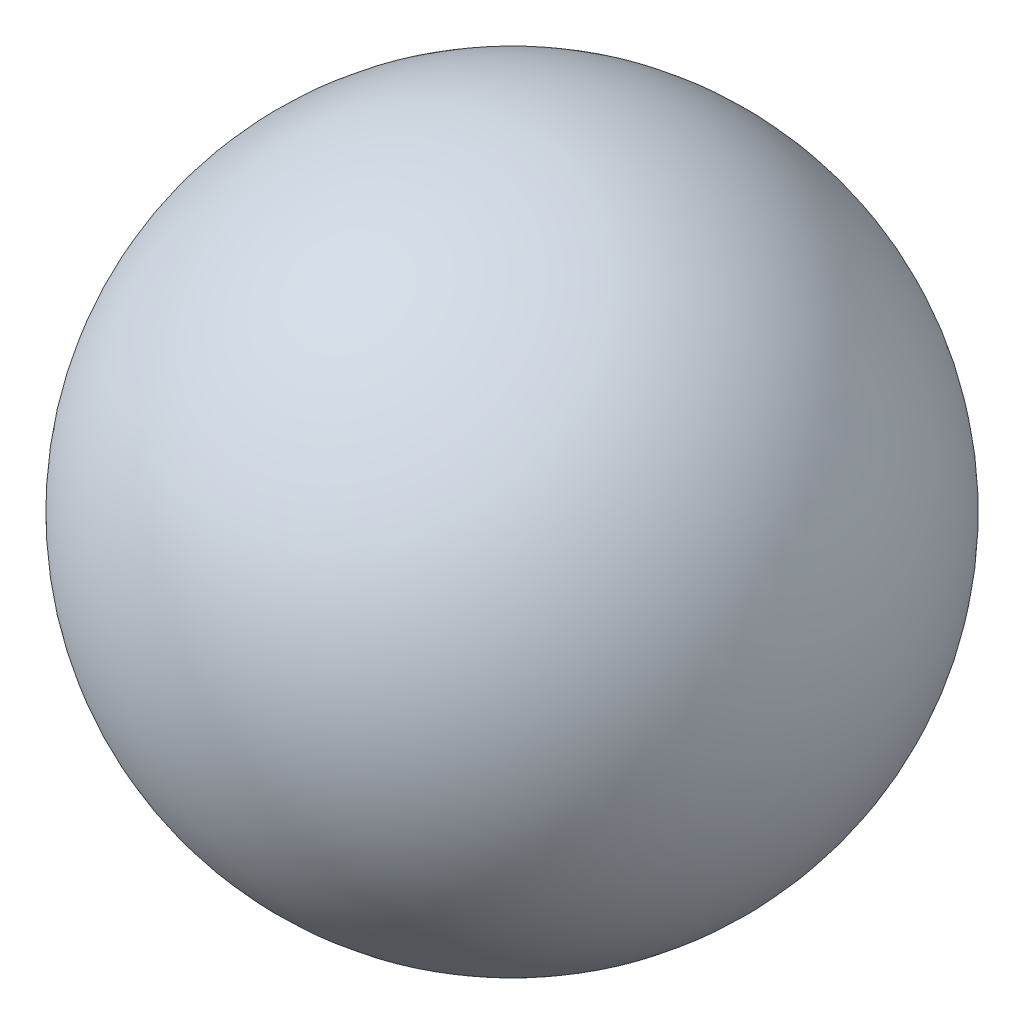
ISO-10303-21;
HEADER;
FILE_DESCRIPTION(('STEP AP214'),'2;1');
FILE_NAME('part.step','',(''),(''),'','','');
FILE_SCHEMA(('AUTOMOTIVE_DESIGN { 1 0 10303 214 1 1 1 1 }'));
ENDSEC;
DATA;
#1=APPLICATION_CONTEXT('core data for automotive mechanical design processes');
#2=APPLICATION_PROTOCOL_DEFINITION('international standard','automotive_design',2000,#1);
#3=PRODUCT_CONTEXT('',#1,'mechanical');
#4=PRODUCT('Part','Part','',(#3));
#5=PRODUCT_RELATED_PRODUCT_CATEGORY('part','',(#4));
#6=PRODUCT_DEFINITION_FORMATION('','',#4);
#7=PRODUCT_DEFINITION_CONTEXT('part definition',#1,'design');
#8=PRODUCT_DEFINITION('design','',#6,#7);
#9=PRODUCT_DEFINITION_SHAPE('','',#8);
#10=(LENGTH_UNIT() NAMED_UNIT(*) SI_UNIT(.MILLI.,.METRE.));
#11=(NAMED_UNIT(*) PLANE_ANGLE_UNIT() SI_UNIT($,.RADIAN.));
#12=(NAMED_UNIT(*) SI_UNIT($,.STERADIAN.) SOLID_ANGLE_UNIT());
#13=UNCERTAINTY_MEASURE_WITH_UNIT(LENGTH_MEASURE(1.E-05),#10,'distance_accuracy_value','');
#14=(GEOMETRIC_REPRESENTATION_CONTEXT(3) GLOBAL_UNCERTAINTY_ASSIGNED_CONTEXT((#13)) GLOBAL_UNIT_ASSIGNED_CONTEXT((#10,
#11,#12)) REPRESENTATION_CONTEXT('',''));
#15=CARTESIAN_POINT('',(0.,0.,0.));
#16=DIRECTION('',(0.,0.,1.));
#17=DIRECTION('',(1.,0.,0.));
#18=AXIS2_PLACEMENT_3D('',#15,#16,#17);
#19=CARTESIAN_POINT('',(0.,0.,0.));
#20=DIRECTION('',(0.,1.,0.));
#21=DIRECTION('',(1.,0.,0.));
#22=AXIS2_PLACEMENT_3D('',#19,#20,#21);
#23=SPHERICAL_SURFACE('',#22,88.9);
#24=CARTESIAN_POINT('',(0.,88.9,0.));
#25=VERTEX_POINT('',#24);
#26=VERTEX_LOOP('',#25);
#27=FACE_BOUND('',#26,.T.);
#28=ADVANCED_FACE('F29',(#27),#23,.T.);
#29=CLOSED_SHELL('',(#28));
#30=MANIFOLD_SOLID_BREP('B2',#29);
#31=ADVANCED_BREP_SHAPE_REPRESENTATION('',(#18,#30),#14);
#32=SHAPE_DEFINITION_REPRESENTATION(#9,#31);
ENDSEC;
END-ISO-10303-21;
